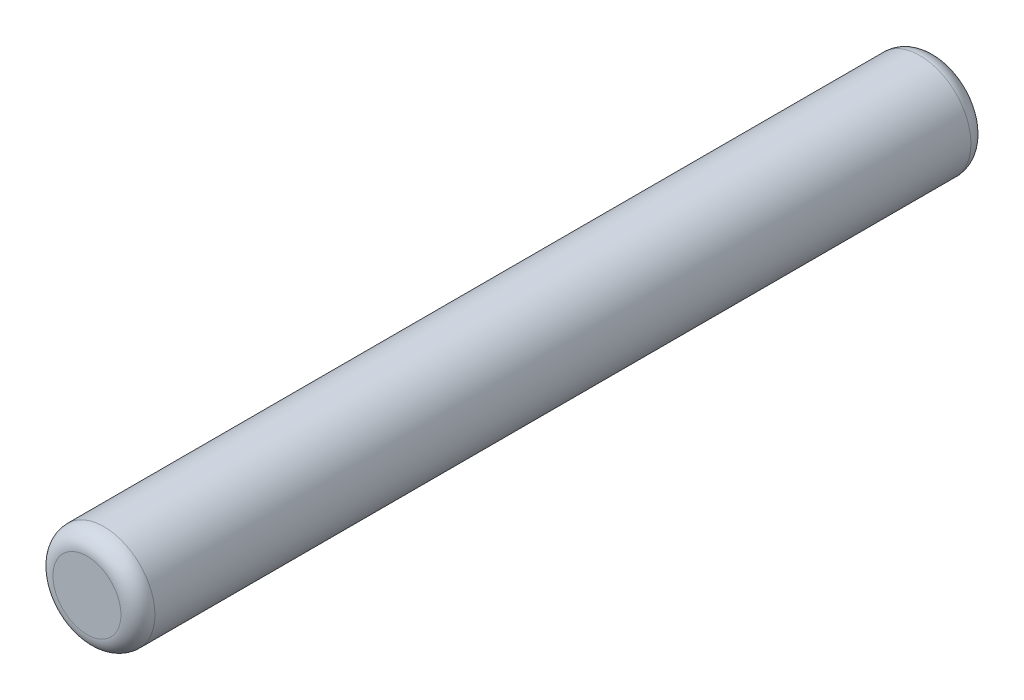
ISO-10303-21;
HEADER;
FILE_DESCRIPTION(('STEP AP214'),'2;1');
FILE_NAME('part.step','',(''),(''),'','','');
FILE_SCHEMA(('AUTOMOTIVE_DESIGN { 1 0 10303 214 1 1 1 1 }'));
ENDSEC;
DATA;
#1=APPLICATION_CONTEXT('core data for automotive mechanical design processes');
#2=APPLICATION_PROTOCOL_DEFINITION('international standard','automotive_design',2000,#1);
#3=PRODUCT_CONTEXT('',#1,'mechanical');
#4=PRODUCT('Part','Part','',(#3));
#5=PRODUCT_RELATED_PRODUCT_CATEGORY('part','',(#4));
#6=PRODUCT_DEFINITION_FORMATION('','',#4);
#7=PRODUCT_DEFINITION_CONTEXT('part definition',#1,'design');
#8=PRODUCT_DEFINITION('design','',#6,#7);
#9=PRODUCT_DEFINITION_SHAPE('','',#8);
#10=(LENGTH_UNIT() NAMED_UNIT(*) SI_UNIT(.MILLI.,.METRE.));
#11=(NAMED_UNIT(*) PLANE_ANGLE_UNIT() SI_UNIT($,.RADIAN.));
#12=(NAMED_UNIT(*) SI_UNIT($,.STERADIAN.) SOLID_ANGLE_UNIT());
#13=UNCERTAINTY_MEASURE_WITH_UNIT(LENGTH_MEASURE(1.E-05),#10,'distance_accuracy_value','');
#14=(GEOMETRIC_REPRESENTATION_CONTEXT(3) GLOBAL_UNCERTAINTY_ASSIGNED_CONTEXT((#13)) GLOBAL_UNIT_ASSIGNED_CONTEXT((#10,
#11,#12)) REPRESENTATION_CONTEXT('',''));
#15=CARTESIAN_POINT('',(0.,0.,0.));
#16=DIRECTION('',(0.,0.,1.));
#17=DIRECTION('',(1.,0.,0.));
#18=AXIS2_PLACEMENT_3D('',#15,#16,#17);
#19=CARTESIAN_POINT('',(0.,0.,12.5));
#20=DIRECTION('',(0.,0.,-1.));
#21=DIRECTION('',(-1.,0.,0.));
#22=AXIS2_PLACEMENT_3D('',#19,#20,#21);
#23=CYLINDRICAL_SURFACE('',#22,1.5);
#24=CARTESIAN_POINT('',(0.,0.,-12.));
#25=DIRECTION('',(0.,0.,1.));
#26=DIRECTION('',(1.,0.,0.));
#27=AXIS2_PLACEMENT_3D('',#24,#25,#26);
#28=CIRCLE('',#27,1.5);
#29=CARTESIAN_POINT('',(1.5,0.,-12.));
#30=VERTEX_POINT('',#29);
#31=EDGE_CURVE('E50',#30,#30,#28,.T.);
#32=ORIENTED_EDGE('',*,*,#31,.T.);
#33=EDGE_LOOP('',(#32));
#34=FACE_BOUND('',#33,.T.);
#35=CARTESIAN_POINT('',(0.,0.,12.));
#36=DIRECTION('',(0.,0.,1.));
#37=DIRECTION('',(1.,0.,0.));
#38=AXIS2_PLACEMENT_3D('',#35,#36,#37);
#39=CIRCLE('',#38,1.5);
#40=CARTESIAN_POINT('',(1.5,0.,12.));
#41=VERTEX_POINT('',#40);
#42=EDGE_CURVE('E54',#41,#41,#39,.F.);
#43=ORIENTED_EDGE('',*,*,#42,.T.);
#44=EDGE_LOOP('',(#43));
#45=FACE_BOUND('',#44,.T.);
#46=ADVANCED_FACE('F39',(#34,#45),#23,.T.);
#47=CARTESIAN_POINT('',(0.,0.,12.5));
#48=DIRECTION('',(0.,0.,1.));
#49=DIRECTION('',(1.,0.,0.));
#50=AXIS2_PLACEMENT_3D('',#47,#48,#49);
#51=PLANE('',#50);
#52=CARTESIAN_POINT('',(0.,0.,12.5));
#53=DIRECTION('',(0.,0.,1.));
#54=DIRECTION('',(1.,0.,0.));
#55=AXIS2_PLACEMENT_3D('',#52,#53,#54);
#56=CIRCLE('',#55,1.);
#57=CARTESIAN_POINT('',(1.,0.,12.5));
#58=VERTEX_POINT('',#57);
#59=EDGE_CURVE('E10',#58,#58,#56,.T.);
#60=ORIENTED_EDGE('',*,*,#59,.T.);
#61=EDGE_LOOP('',(#60));
#62=FACE_BOUND('',#61,.T.);
#63=ADVANCED_FACE('F70',(#62),#51,.T.);
#64=CARTESIAN_POINT('',(0.,0.,-12.5));
#65=DIRECTION('',(0.,0.,1.));
#66=DIRECTION('',(1.,0.,0.));
#67=AXIS2_PLACEMENT_3D('',#64,#65,#66);
#68=PLANE('',#67);
#69=CARTESIAN_POINT('',(0.,0.,-12.5));
#70=DIRECTION('',(0.,0.,1.));
#71=DIRECTION('',(1.,0.,0.));
#72=AXIS2_PLACEMENT_3D('',#69,#70,#71);
#73=CIRCLE('',#72,1.);
#74=CARTESIAN_POINT('',(1.,0.,-12.5));
#75=VERTEX_POINT('',#74);
#76=EDGE_CURVE('E46',#75,#75,#73,.F.);
#77=ORIENTED_EDGE('',*,*,#76,.T.);
#78=EDGE_LOOP('',(#77));
#79=FACE_BOUND('',#78,.T.);
#80=ADVANCED_FACE('F67',(#79),#68,.F.);
#81=CARTESIAN_POINT('',(0.,0.,-12.));
#82=DIRECTION('',(0.,0.,1.));
#83=DIRECTION('',(1.,0.,0.));
#84=AXIS2_PLACEMENT_3D('',#81,#82,#83);
#85=TOROIDAL_SURFACE('',#84,1.,0.5);
#86=ORIENTED_EDGE('',*,*,#76,.F.);
#87=EDGE_LOOP('',(#86));
#88=FACE_BOUND('',#87,.T.);
#89=ORIENTED_EDGE('',*,*,#31,.F.);
#90=EDGE_LOOP('',(#89));
#91=FACE_BOUND('',#90,.T.);
#92=ADVANCED_FACE('F63',(#88,#91),#85,.T.);
#93=CARTESIAN_POINT('',(0.,0.,12.));
#94=DIRECTION('',(0.,0.,1.));
#95=DIRECTION('',(1.,0.,0.));
#96=AXIS2_PLACEMENT_3D('',#93,#94,#95);
#97=TOROIDAL_SURFACE('',#96,1.,0.5);
#98=ORIENTED_EDGE('',*,*,#42,.F.);
#99=EDGE_LOOP('',(#98));
#100=FACE_BOUND('',#99,.T.);
#101=ORIENTED_EDGE('',*,*,#59,.F.);
#102=EDGE_LOOP('',(#101));
#103=FACE_BOUND('',#102,.T.);
#104=ADVANCED_FACE('F41',(#100,#103),#97,.T.);
#105=CLOSED_SHELL('',(#46,#63,#80,#92,#104));
#106=MANIFOLD_SOLID_BREP('B2',#105);
#107=ADVANCED_BREP_SHAPE_REPRESENTATION('',(#18,#106),#14);
#108=SHAPE_DEFINITION_REPRESENTATION(#9,#107);
ENDSEC;
END-ISO-10303-21;
